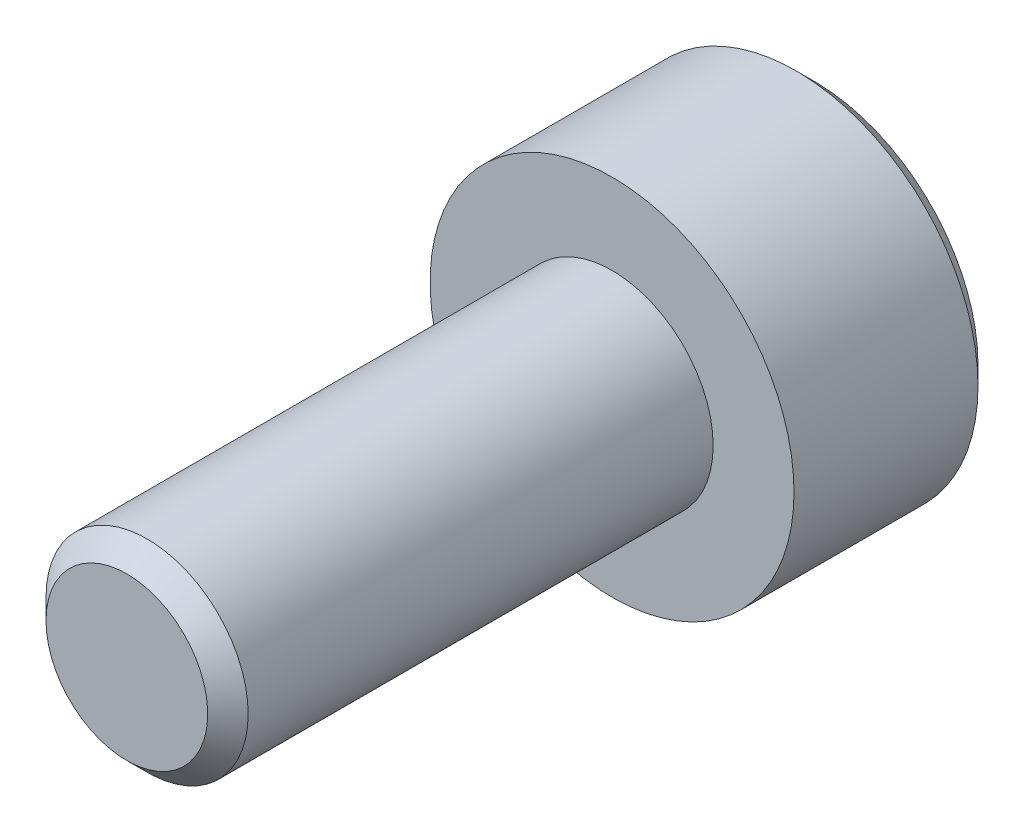
ISO-10303-21;
HEADER;
FILE_DESCRIPTION(('STEP AP214'),'2;1');
FILE_NAME('part.step','',(''),(''),'','','');
FILE_SCHEMA(('AUTOMOTIVE_DESIGN { 1 0 10303 214 1 1 1 1 }'));
ENDSEC;
DATA;
#1=APPLICATION_CONTEXT('core data for automotive mechanical design processes');
#2=APPLICATION_PROTOCOL_DEFINITION('international standard','automotive_design',2000,#1);
#3=PRODUCT_CONTEXT('',#1,'mechanical');
#4=PRODUCT('Part','Part','',(#3));
#5=PRODUCT_RELATED_PRODUCT_CATEGORY('part','',(#4));
#6=PRODUCT_DEFINITION_FORMATION('','',#4);
#7=PRODUCT_DEFINITION_CONTEXT('part definition',#1,'design');
#8=PRODUCT_DEFINITION('design','',#6,#7);
#9=PRODUCT_DEFINITION_SHAPE('','',#8);
#10=(LENGTH_UNIT() NAMED_UNIT(*) SI_UNIT(.MILLI.,.METRE.));
#11=(NAMED_UNIT(*) PLANE_ANGLE_UNIT() SI_UNIT($,.RADIAN.));
#12=(NAMED_UNIT(*) SI_UNIT($,.STERADIAN.) SOLID_ANGLE_UNIT());
#13=UNCERTAINTY_MEASURE_WITH_UNIT(LENGTH_MEASURE(1.E-05),#10,'distance_accuracy_value','');
#14=(GEOMETRIC_REPRESENTATION_CONTEXT(3) GLOBAL_UNCERTAINTY_ASSIGNED_CONTEXT((#13)) GLOBAL_UNIT_ASSIGNED_CONTEXT((#10,
#11,#12)) REPRESENTATION_CONTEXT('',''));
#15=CARTESIAN_POINT('',(0.,0.,0.));
#16=DIRECTION('',(0.,0.,1.));
#17=DIRECTION('',(1.,0.,0.));
#18=AXIS2_PLACEMENT_3D('',#15,#16,#17);
#19=CARTESIAN_POINT('',(0.,0.,-1.5));
#20=DIRECTION('',(0.,0.,1.));
#21=DIRECTION('',(1.,0.,0.));
#22=AXIS2_PLACEMENT_3D('',#19,#20,#21);
#23=PLANE('',#22);
#24=DIRECTION('',(0.,1.,0.));
#25=VECTOR('',#24,1.);
#26=CARTESIAN_POINT('',(-1.,-0.577350269189626,-1.5));
#27=LINE('',#26,#25);
#28=CARTESIAN_POINT('',(-1.,-0.577350269189625,-1.5));
#29=VERTEX_POINT('',#28);
#30=CARTESIAN_POINT('',(-1.,0.577350269189626,-1.5));
#31=VERTEX_POINT('',#30);
#32=EDGE_CURVE('E68',#29,#31,#27,.T.);
#33=ORIENTED_EDGE('',*,*,#32,.T.);
#34=DIRECTION('',(-0.866025403784439,-0.5,0.));
#35=VECTOR('',#34,1.);
#36=CARTESIAN_POINT('',(-1.,0.577350269189626,-1.5));
#37=LINE('',#36,#35);
#38=CARTESIAN_POINT('',(0.,1.15470053837925,-1.5));
#39=VERTEX_POINT('',#38);
#40=EDGE_CURVE('E91',#31,#39,#37,.F.);
#41=ORIENTED_EDGE('',*,*,#40,.T.);
#42=DIRECTION('',(-0.866025403784439,0.5,0.));
#43=VECTOR('',#42,1.);
#44=CARTESIAN_POINT('',(0.,1.15470053837925,-1.5));
#45=LINE('',#44,#43);
#46=CARTESIAN_POINT('',(1.,0.577350269189626,-1.5));
#47=VERTEX_POINT('',#46);
#48=EDGE_CURVE('E130',#39,#47,#45,.F.);
#49=ORIENTED_EDGE('',*,*,#48,.T.);
#50=DIRECTION('',(0.,1.,0.));
#51=VECTOR('',#50,1.);
#52=CARTESIAN_POINT('',(1.,0.577350269189626,-1.5));
#53=LINE('',#52,#51);
#54=CARTESIAN_POINT('',(1.,-0.577350269189626,-1.5));
#55=VERTEX_POINT('',#54);
#56=EDGE_CURVE('E125',#47,#55,#53,.F.);
#57=ORIENTED_EDGE('',*,*,#56,.T.);
#58=DIRECTION('',(0.866025403784439,0.499999999999999,0.));
#59=VECTOR('',#58,1.);
#60=CARTESIAN_POINT('',(1.,-0.577350269189626,-1.5));
#61=LINE('',#60,#59);
#62=CARTESIAN_POINT('',(0.,-1.15470053837925,-1.5));
#63=VERTEX_POINT('',#62);
#64=EDGE_CURVE('E74',#55,#63,#61,.F.);
#65=ORIENTED_EDGE('',*,*,#64,.T.);
#66=DIRECTION('',(0.866025403784438,-0.5,0.));
#67=VECTOR('',#66,1.);
#68=CARTESIAN_POINT('',(0.,-1.15470053837925,-1.5));
#69=LINE('',#68,#67);
#70=EDGE_CURVE('E71',#63,#29,#69,.F.);
#71=ORIENTED_EDGE('',*,*,#70,.T.);
#72=EDGE_LOOP('',(#33,#41,#49,#57,#65,#71));
#73=FACE_BOUND('',#72,.T.);
#74=ADVANCED_FACE('F17',(#73),#23,.F.);
#75=CARTESIAN_POINT('',(0.,-1.15470053837925,-2.5));
#76=DIRECTION('',(-0.5,-0.866025403784438,0.));
#77=DIRECTION('',(0.866025403784438,-0.5,0.));
#78=AXIS2_PLACEMENT_3D('',#75,#76,#77);
#79=PLANE('',#78);
#80=ORIENTED_EDGE('',*,*,#70,.F.);
#81=DIRECTION('',(0.,0.,1.));
#82=VECTOR('',#81,1.);
#83=CARTESIAN_POINT('',(0.,-1.15470053837925,-2.5));
#84=LINE('',#83,#82);
#85=CARTESIAN_POINT('',(0.,-1.15470053837925,-2.5));
#86=VERTEX_POINT('',#85);
#87=EDGE_CURVE('E120',#63,#86,#84,.F.);
#88=ORIENTED_EDGE('',*,*,#87,.T.);
#89=DIRECTION('',(-0.866025403784439,0.499999999999999,0.));
#90=VECTOR('',#89,1.);
#91=CARTESIAN_POINT('',(0.,-1.15470053837925,-2.5));
#92=LINE('',#91,#90);
#93=CARTESIAN_POINT('',(-1.,-0.577350269189625,-2.5));
#94=VERTEX_POINT('',#93);
#95=EDGE_CURVE('E82',#86,#94,#92,.T.);
#96=ORIENTED_EDGE('',*,*,#95,.T.);
#97=DIRECTION('',(0.,0.,1.));
#98=VECTOR('',#97,1.);
#99=CARTESIAN_POINT('',(-1.,-0.577350269189626,-2.5));
#100=LINE('',#99,#98);
#101=EDGE_CURVE('E77',#94,#29,#100,.T.);
#102=ORIENTED_EDGE('',*,*,#101,.T.);
#103=EDGE_LOOP('',(#80,#88,#96,#102));
#104=FACE_BOUND('',#103,.T.);
#105=ADVANCED_FACE('F80',(#104),#79,.F.);
#106=CARTESIAN_POINT('',(-1.,-0.577350269189626,-2.5));
#107=DIRECTION('',(-1.,0.,0.));
#108=DIRECTION('',(0.,0.,1.));
#109=AXIS2_PLACEMENT_3D('',#106,#107,#108);
#110=PLANE('',#109);
#111=ORIENTED_EDGE('',*,*,#32,.F.);
#112=ORIENTED_EDGE('',*,*,#101,.F.);
#113=DIRECTION('',(0.,1.,0.));
#114=VECTOR('',#113,1.);
#115=CARTESIAN_POINT('',(-1.,0.,-2.5));
#116=LINE('',#115,#114);
#117=CARTESIAN_POINT('',(-1.,0.577350269189626,-2.5));
#118=VERTEX_POINT('',#117);
#119=EDGE_CURVE('E117',#94,#118,#116,.T.);
#120=ORIENTED_EDGE('',*,*,#119,.T.);
#121=DIRECTION('',(0.,0.,1.));
#122=VECTOR('',#121,1.);
#123=CARTESIAN_POINT('',(-1.,0.577350269189626,-2.5));
#124=LINE('',#123,#122);
#125=EDGE_CURVE('E88',#118,#31,#124,.T.);
#126=ORIENTED_EDGE('',*,*,#125,.T.);
#127=EDGE_LOOP('',(#111,#112,#120,#126));
#128=FACE_BOUND('',#127,.T.);
#129=ADVANCED_FACE('F86',(#128),#110,.F.);
#130=CARTESIAN_POINT('',(-1.,0.577350269189626,-2.5));
#131=DIRECTION('',(-0.5,0.866025403784439,0.));
#132=DIRECTION('',(-0.866025403784439,-0.5,0.));
#133=AXIS2_PLACEMENT_3D('',#130,#131,#132);
#134=PLANE('',#133);
#135=ORIENTED_EDGE('',*,*,#40,.F.);
#136=ORIENTED_EDGE('',*,*,#125,.F.);
#137=DIRECTION('',(0.866025403784439,0.499999999999999,0.));
#138=VECTOR('',#137,1.);
#139=CARTESIAN_POINT('',(-1.,0.577350269189626,-2.5));
#140=LINE('',#139,#138);
#141=CARTESIAN_POINT('',(0.,1.15470053837925,-2.5));
#142=VERTEX_POINT('',#141);
#143=EDGE_CURVE('E115',#118,#142,#140,.T.);
#144=ORIENTED_EDGE('',*,*,#143,.T.);
#145=DIRECTION('',(0.,0.,1.));
#146=VECTOR('',#145,1.);
#147=CARTESIAN_POINT('',(0.,1.15470053837925,-2.5));
#148=LINE('',#147,#146);
#149=EDGE_CURVE('E132',#142,#39,#148,.T.);
#150=ORIENTED_EDGE('',*,*,#149,.T.);
#151=EDGE_LOOP('',(#135,#136,#144,#150));
#152=FACE_BOUND('',#151,.T.);
#153=ADVANCED_FACE('F137',(#152),#134,.F.);
#154=CARTESIAN_POINT('',(0.,1.15470053837925,-2.5));
#155=DIRECTION('',(0.5,0.866025403784439,0.));
#156=DIRECTION('',(-0.866025403784439,0.5,0.));
#157=AXIS2_PLACEMENT_3D('',#154,#155,#156);
#158=PLANE('',#157);
#159=ORIENTED_EDGE('',*,*,#48,.F.);
#160=ORIENTED_EDGE('',*,*,#149,.F.);
#161=DIRECTION('',(0.866025403784439,-0.499999999999999,0.));
#162=VECTOR('',#161,1.);
#163=CARTESIAN_POINT('',(0.,1.15470053837925,-2.5));
#164=LINE('',#163,#162);
#165=CARTESIAN_POINT('',(1.,0.577350269189626,-2.5));
#166=VERTEX_POINT('',#165);
#167=EDGE_CURVE('E113',#142,#166,#164,.T.);
#168=ORIENTED_EDGE('',*,*,#167,.T.);
#169=DIRECTION('',(0.,0.,-1.));
#170=VECTOR('',#169,1.);
#171=CARTESIAN_POINT('',(1.,0.577350269189626,-2.5));
#172=LINE('',#171,#170);
#173=EDGE_CURVE('E127',#166,#47,#172,.F.);
#174=ORIENTED_EDGE('',*,*,#173,.T.);
#175=EDGE_LOOP('',(#159,#160,#168,#174));
#176=FACE_BOUND('',#175,.T.);
#177=ADVANCED_FACE('F141',(#176),#158,.F.);
#178=CARTESIAN_POINT('',(1.,0.577350269189626,-2.5));
#179=DIRECTION('',(1.,0.,0.));
#180=DIRECTION('',(0.,0.,-1.));
#181=AXIS2_PLACEMENT_3D('',#178,#179,#180);
#182=PLANE('',#181);
#183=ORIENTED_EDGE('',*,*,#56,.F.);
#184=ORIENTED_EDGE('',*,*,#173,.F.);
#185=DIRECTION('',(0.,1.,0.));
#186=VECTOR('',#185,1.);
#187=CARTESIAN_POINT('',(1.,0.,-2.5));
#188=LINE('',#187,#186);
#189=CARTESIAN_POINT('',(1.,-0.577350269189626,-2.5));
#190=VERTEX_POINT('',#189);
#191=EDGE_CURVE('E35',#166,#190,#188,.F.);
#192=ORIENTED_EDGE('',*,*,#191,.T.);
#193=DIRECTION('',(0.,0.,1.));
#194=VECTOR('',#193,1.);
#195=CARTESIAN_POINT('',(1.,-0.577350269189626,-2.5));
#196=LINE('',#195,#194);
#197=EDGE_CURVE('E123',#190,#55,#196,.T.);
#198=ORIENTED_EDGE('',*,*,#197,.T.);
#199=EDGE_LOOP('',(#183,#184,#192,#198));
#200=FACE_BOUND('',#199,.T.);
#201=ADVANCED_FACE('F143',(#200),#182,.F.);
#202=CARTESIAN_POINT('',(1.,-0.577350269189626,-2.5));
#203=DIRECTION('',(0.499999999999999,-0.866025403784439,0.));
#204=DIRECTION('',(0.866025403784439,0.499999999999999,0.));
#205=AXIS2_PLACEMENT_3D('',#202,#203,#204);
#206=PLANE('',#205);
#207=ORIENTED_EDGE('',*,*,#64,.F.);
#208=ORIENTED_EDGE('',*,*,#197,.F.);
#209=DIRECTION('',(-0.86602540378444,-0.499999999999998,0.));
#210=VECTOR('',#209,1.);
#211=CARTESIAN_POINT('',(1.,-0.577350269189626,-2.5));
#212=LINE('',#211,#210);
#213=EDGE_CURVE('E107',#190,#86,#212,.T.);
#214=ORIENTED_EDGE('',*,*,#213,.T.);
#215=ORIENTED_EDGE('',*,*,#87,.F.);
#216=EDGE_LOOP('',(#207,#208,#214,#215));
#217=FACE_BOUND('',#216,.T.);
#218=ADVANCED_FACE('F146',(#217),#206,.F.);
#219=CARTESIAN_POINT('',(0.,0.,-2.5));
#220=DIRECTION('',(0.,0.,1.));
#221=DIRECTION('',(1.,0.,0.));
#222=AXIS2_PLACEMENT_3D('',#219,#220,#221);
#223=PLANE('',#222);
#224=ORIENTED_EDGE('',*,*,#191,.F.);
#225=ORIENTED_EDGE('',*,*,#167,.F.);
#226=ORIENTED_EDGE('',*,*,#143,.F.);
#227=ORIENTED_EDGE('',*,*,#119,.F.);
#228=ORIENTED_EDGE('',*,*,#95,.F.);
#229=ORIENTED_EDGE('',*,*,#213,.F.);
#230=EDGE_LOOP('',(#224,#225,#226,#227,#228,#229));
#231=FACE_BOUND('',#230,.T.);
#232=CARTESIAN_POINT('',(0.,0.,-2.49999999999773));
#233=DIRECTION('',(0.,0.,1.));
#234=DIRECTION('',(1.,0.,0.));
#235=AXIS2_PLACEMENT_3D('',#232,#233,#234);
#236=CIRCLE('',#235,2.02499999994643);
#237=CARTESIAN_POINT('',(2.02499999994643,0.,-2.49999999999773));
#238=VERTEX_POINT('',#237);
#239=EDGE_CURVE('E20',#238,#238,#236,.T.);
#240=ORIENTED_EDGE('',*,*,#239,.F.);
#241=EDGE_LOOP('',(#240));
#242=FACE_BOUND('',#241,.T.);
#243=ADVANCED_FACE('F148',(#231,#242),#223,.F.);
#244=CARTESIAN_POINT('',(0.,0.,-2.27499999988368));
#245=DIRECTION('',(0.,0.,1.));
#246=DIRECTION('',(1.,0.,0.));
#247=AXIS2_PLACEMENT_3D('',#244,#245,#246);
#248=CONICAL_SURFACE('',#247,2.25000000006048,0.785398163397448);
#249=ORIENTED_EDGE('',*,*,#239,.T.);
#250=EDGE_LOOP('',(#249));
#251=FACE_BOUND('',#250,.T.);
#252=CARTESIAN_POINT('',(0.,0.,-2.275));
#253=DIRECTION('',(0.,0.,1.));
#254=DIRECTION('',(1.,0.,0.));
#255=AXIS2_PLACEMENT_3D('',#252,#253,#254);
#256=CIRCLE('',#255,2.25);
#257=CARTESIAN_POINT('',(2.25,0.,-2.275));
#258=VERTEX_POINT('',#257);
#259=EDGE_CURVE('E99',#258,#258,#256,.T.);
#260=ORIENTED_EDGE('',*,*,#259,.F.);
#261=EDGE_LOOP('',(#260));
#262=FACE_BOUND('',#261,.T.);
#263=ADVANCED_FACE('F151',(#251,#262),#248,.T.);
#264=CARTESIAN_POINT('',(0.,0.,6.));
#265=DIRECTION('',(0.,0.,1.));
#266=DIRECTION('',(1.,0.,0.));
#267=AXIS2_PLACEMENT_3D('',#264,#265,#266);
#268=PLANE('',#267);
#269=CARTESIAN_POINT('',(0.,0.,5.99999999997181));
#270=DIRECTION('',(0.,0.,-1.));
#271=DIRECTION('',(-1.,0.,0.));
#272=AXIS2_PLACEMENT_3D('',#269,#270,#271);
#273=CIRCLE('',#272,0.999999999976353);
#274=CARTESIAN_POINT('',(-0.999999999976353,0.,5.99999999997181));
#275=VERTEX_POINT('',#274);
#276=EDGE_CURVE('E97',#275,#275,#273,.T.);
#277=ORIENTED_EDGE('',*,*,#276,.F.);
#278=EDGE_LOOP('',(#277));
#279=FACE_BOUND('',#278,.T.);
#280=ADVANCED_FACE('F157',(#279),#268,.T.);
#281=CARTESIAN_POINT('',(0.,0.,-2.5));
#282=DIRECTION('',(0.,0.,1.));
#283=DIRECTION('',(1.,0.,0.));
#284=AXIS2_PLACEMENT_3D('',#281,#282,#283);
#285=CYLINDRICAL_SURFACE('',#284,2.25);
#286=ORIENTED_EDGE('',*,*,#259,.T.);
#287=EDGE_LOOP('',(#286));
#288=FACE_BOUND('',#287,.T.);
#289=CARTESIAN_POINT('',(0.,0.,0.));
#290=DIRECTION('',(0.,0.,1.));
#291=DIRECTION('',(1.,0.,0.));
#292=AXIS2_PLACEMENT_3D('',#289,#290,#291);
#293=CIRCLE('',#292,2.25);
#294=CARTESIAN_POINT('',(2.25,0.,0.));
#295=VERTEX_POINT('',#294);
#296=EDGE_CURVE('E95',#295,#295,#293,.T.);
#297=ORIENTED_EDGE('',*,*,#296,.F.);
#298=EDGE_LOOP('',(#297));
#299=FACE_BOUND('',#298,.T.);
#300=ADVANCED_FACE('F163',(#288,#299),#285,.T.);
#301=CARTESIAN_POINT('',(0.,0.,5.74999999997772));
#302=DIRECTION('',(0.,0.,-1.));
#303=DIRECTION('',(-1.,0.,0.));
#304=AXIS2_PLACEMENT_3D('',#301,#302,#303);
#305=CONICAL_SURFACE('',#304,1.24999999997044,0.785398163397448);
#306=CARTESIAN_POINT('',(0.,0.,5.75));
#307=DIRECTION('',(0.,0.,1.));
#308=DIRECTION('',(1.,0.,0.));
#309=AXIS2_PLACEMENT_3D('',#306,#307,#308);
#310=CIRCLE('',#309,1.25);
#311=CARTESIAN_POINT('',(1.25,0.,5.75));
#312=VERTEX_POINT('',#311);
#313=EDGE_CURVE('E26',#312,#312,#310,.F.);
#314=ORIENTED_EDGE('',*,*,#313,.F.);
#315=EDGE_LOOP('',(#314));
#316=FACE_BOUND('',#315,.T.);
#317=ORIENTED_EDGE('',*,*,#276,.T.);
#318=EDGE_LOOP('',(#317));
#319=FACE_BOUND('',#318,.T.);
#320=ADVANCED_FACE('F174',(#316,#319),#305,.T.);
#321=CARTESIAN_POINT('',(0.,0.,0.));
#322=DIRECTION('',(0.,0.,1.));
#323=DIRECTION('',(1.,0.,0.));
#324=AXIS2_PLACEMENT_3D('',#321,#322,#323);
#325=PLANE('',#324);
#326=CARTESIAN_POINT('',(0.,0.,0.));
#327=DIRECTION('',(0.,0.,1.));
#328=DIRECTION('',(1.,0.,0.));
#329=AXIS2_PLACEMENT_3D('',#326,#327,#328);
#330=CIRCLE('',#329,1.25);
#331=CARTESIAN_POINT('',(1.25,0.,0.));
#332=VERTEX_POINT('',#331);
#333=EDGE_CURVE('E11',#332,#332,#330,.T.);
#334=ORIENTED_EDGE('',*,*,#333,.F.);
#335=EDGE_LOOP('',(#334));
#336=FACE_BOUND('',#335,.T.);
#337=ORIENTED_EDGE('',*,*,#296,.T.);
#338=EDGE_LOOP('',(#337));
#339=FACE_BOUND('',#338,.T.);
#340=ADVANCED_FACE('F168',(#336,#339),#325,.T.);
#341=CARTESIAN_POINT('',(0.,0.,0.));
#342=DIRECTION('',(0.,0.,1.));
#343=DIRECTION('',(1.,0.,0.));
#344=AXIS2_PLACEMENT_3D('',#341,#342,#343);
#345=CYLINDRICAL_SURFACE('',#344,1.25);
#346=ORIENTED_EDGE('',*,*,#333,.T.);
#347=EDGE_LOOP('',(#346));
#348=FACE_BOUND('',#347,.T.);
#349=ORIENTED_EDGE('',*,*,#313,.T.);
#350=EDGE_LOOP('',(#349));
#351=FACE_BOUND('',#350,.T.);
#352=ADVANCED_FACE('F166',(#348,#351),#345,.T.);
#353=CLOSED_SHELL('',(#74,#105,#129,#153,#177,#201,#218,#243,#263,#280,#300,#320,#340,#352));
#354=MANIFOLD_SOLID_BREP('B1',#353);
#355=ADVANCED_BREP_SHAPE_REPRESENTATION('',(#18,#354),#14);
#356=SHAPE_DEFINITION_REPRESENTATION(#9,#355);
ENDSEC;
END-ISO-10303-21;
